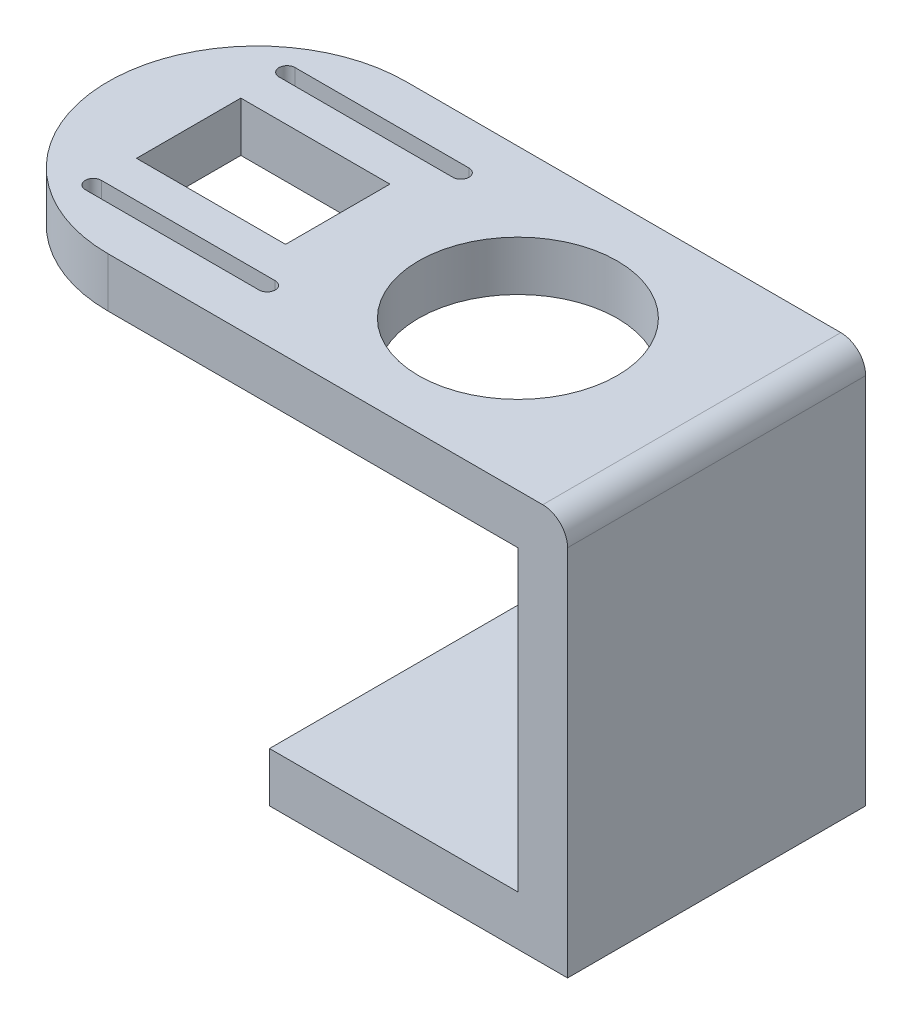
ISO-10303-21;
HEADER;
FILE_DESCRIPTION(('STEP AP214'),'2;1');
FILE_NAME('part.step','',(''),(''),'','','');
FILE_SCHEMA(('AUTOMOTIVE_DESIGN { 1 0 10303 214 1 1 1 1 }'));
ENDSEC;
DATA;
#1=APPLICATION_CONTEXT('core data for automotive mechanical design processes');
#2=APPLICATION_PROTOCOL_DEFINITION('international standard','automotive_design',2000,#1);
#3=PRODUCT_CONTEXT('',#1,'mechanical');
#4=PRODUCT('Part','Part','',(#3));
#5=PRODUCT_RELATED_PRODUCT_CATEGORY('part','',(#4));
#6=PRODUCT_DEFINITION_FORMATION('','',#4);
#7=PRODUCT_DEFINITION_CONTEXT('part definition',#1,'design');
#8=PRODUCT_DEFINITION('design','',#6,#7);
#9=PRODUCT_DEFINITION_SHAPE('','',#8);
#10=(LENGTH_UNIT() NAMED_UNIT(*) SI_UNIT(.MILLI.,.METRE.));
#11=(NAMED_UNIT(*) PLANE_ANGLE_UNIT() SI_UNIT($,.RADIAN.));
#12=(NAMED_UNIT(*) SI_UNIT($,.STERADIAN.) SOLID_ANGLE_UNIT());
#13=UNCERTAINTY_MEASURE_WITH_UNIT(LENGTH_MEASURE(1.E-05),#10,'distance_accuracy_value','');
#14=(GEOMETRIC_REPRESENTATION_CONTEXT(3) GLOBAL_UNCERTAINTY_ASSIGNED_CONTEXT((#13)) GLOBAL_UNIT_ASSIGNED_CONTEXT((#10,
#11,#12)) REPRESENTATION_CONTEXT('',''));
#15=CARTESIAN_POINT('',(0.,0.,0.));
#16=DIRECTION('',(0.,0.,1.));
#17=DIRECTION('',(1.,0.,0.));
#18=AXIS2_PLACEMENT_3D('',#15,#16,#17);
#19=CARTESIAN_POINT('',(-20.,140.,120.));
#20=DIRECTION('',(0.,-1.,0.));
#21=DIRECTION('',(0.,0.,-1.));
#22=AXIS2_PLACEMENT_3D('',#19,#20,#21);
#23=PLANE('',#22);
#24=DIRECTION('',(1.,0.,0.));
#25=VECTOR('',#24,1.);
#26=CARTESIAN_POINT('',(-20.,140.,17.45));
#27=LINE('',#26,#25);
#28=CARTESIAN_POINT('',(-212.234124068661,140.,17.45));
#29=VERTEX_POINT('',#28);
#30=CARTESIAN_POINT('',(-142.234124068661,140.,17.45));
#31=VERTEX_POINT('',#30);
#32=EDGE_CURVE('E228',#29,#31,#27,.T.);
#33=ORIENTED_EDGE('',*,*,#32,.F.);
#34=CARTESIAN_POINT('',(-212.234124068661,140.,20.7));
#35=DIRECTION('',(0.,-1.,0.));
#36=DIRECTION('',(0.,0.,-1.));
#37=AXIS2_PLACEMENT_3D('',#34,#35,#36);
#38=CIRCLE('',#37,3.25);
#39=CARTESIAN_POINT('',(-212.234124068661,140.,23.95));
#40=VERTEX_POINT('',#39);
#41=EDGE_CURVE('E293',#40,#29,#38,.T.);
#42=ORIENTED_EDGE('',*,*,#41,.F.);
#43=DIRECTION('',(1.,0.,0.));
#44=VECTOR('',#43,1.);
#45=CARTESIAN_POINT('',(-20.,140.,23.95));
#46=LINE('',#45,#44);
#47=CARTESIAN_POINT('',(-142.234124068661,140.,23.95));
#48=VERTEX_POINT('',#47);
#49=EDGE_CURVE('E290',#40,#48,#46,.T.);
#50=ORIENTED_EDGE('',*,*,#49,.T.);
#51=CARTESIAN_POINT('',(-142.234124068661,140.,20.7));
#52=DIRECTION('',(0.,-1.,0.));
#53=DIRECTION('',(0.,0.,-1.));
#54=AXIS2_PLACEMENT_3D('',#51,#52,#53);
#55=CIRCLE('',#54,3.25);
#56=EDGE_CURVE('E288',#31,#48,#55,.T.);
#57=ORIENTED_EDGE('',*,*,#56,.F.);
#58=EDGE_LOOP('',(#33,#42,#50,#57));
#59=FACE_BOUND('',#58,.T.);
#60=CARTESIAN_POINT('',(-141.937175822194,140.,99.));
#61=DIRECTION('',(0.,-1.,0.));
#62=DIRECTION('',(0.,0.,-1.));
#63=AXIS2_PLACEMENT_3D('',#60,#61,#62);
#64=CIRCLE('',#63,3.25);
#65=CARTESIAN_POINT('',(-141.937175822194,140.,95.75));
#66=VERTEX_POINT('',#65);
#67=CARTESIAN_POINT('',(-141.937175822194,140.,102.25));
#68=VERTEX_POINT('',#67);
#69=EDGE_CURVE('E285',#66,#68,#64,.T.);
#70=ORIENTED_EDGE('',*,*,#69,.F.);
#71=DIRECTION('',(1.,0.,0.));
#72=VECTOR('',#71,1.);
#73=CARTESIAN_POINT('',(-20.,140.,95.75));
#74=LINE('',#73,#72);
#75=CARTESIAN_POINT('',(-211.937175822194,140.,95.75));
#76=VERTEX_POINT('',#75);
#77=EDGE_CURVE('E283',#76,#66,#74,.T.);
#78=ORIENTED_EDGE('',*,*,#77,.F.);
#79=CARTESIAN_POINT('',(-211.937175822194,140.,99.));
#80=DIRECTION('',(0.,-1.,0.));
#81=DIRECTION('',(0.,0.,-1.));
#82=AXIS2_PLACEMENT_3D('',#79,#80,#81);
#83=CIRCLE('',#82,3.25);
#84=CARTESIAN_POINT('',(-211.937175822194,140.,102.25));
#85=VERTEX_POINT('',#84);
#86=EDGE_CURVE('E281',#85,#76,#83,.T.);
#87=ORIENTED_EDGE('',*,*,#86,.F.);
#88=DIRECTION('',(1.,0.,0.));
#89=VECTOR('',#88,1.);
#90=CARTESIAN_POINT('',(-20.,140.,102.25));
#91=LINE('',#90,#89);
#92=EDGE_CURVE('E256',#85,#68,#91,.T.);
#93=ORIENTED_EDGE('',*,*,#92,.T.);
#94=EDGE_LOOP('',(#70,#78,#87,#93));
#95=FACE_BOUND('',#94,.T.);
#96=CARTESIAN_POINT('',(-53.7500000000003,140.,14.5336663013152));
#97=DIRECTION('',(0.,-1.,0.));
#98=DIRECTION('',(0.,0.,-1.));
#99=AXIS2_PLACEMENT_3D('',#96,#97,#98);
#100=CIRCLE('',#99,2.5);
#101=CARTESIAN_POINT('',(-53.7500000000003,140.,12.0336663013152));
#102=VERTEX_POINT('',#101);
#103=EDGE_CURVE('E328',#102,#102,#100,.T.);
#104=ORIENTED_EDGE('',*,*,#103,.F.);
#105=EDGE_LOOP('',(#104));
#106=FACE_BOUND('',#105,.T.);
#107=CARTESIAN_POINT('',(-132.5,140.,60.));
#108=DIRECTION('',(0.,-1.,0.));
#109=DIRECTION('',(0.,0.,-1.));
#110=AXIS2_PLACEMENT_3D('',#107,#108,#109);
#111=CIRCLE('',#110,2.5);
#112=CARTESIAN_POINT('',(-132.5,140.,57.5));
#113=VERTEX_POINT('',#112);
#114=EDGE_CURVE('E334',#113,#113,#111,.T.);
#115=ORIENTED_EDGE('',*,*,#114,.F.);
#116=EDGE_LOOP('',(#115));
#117=FACE_BOUND('',#116,.T.);
#118=CARTESIAN_POINT('',(-53.7499999999991,140.,105.466333698682));
#119=DIRECTION('',(0.,-1.,0.));
#120=DIRECTION('',(0.,0.,-1.));
#121=AXIS2_PLACEMENT_3D('',#118,#119,#120);
#122=CIRCLE('',#121,2.5);
#123=CARTESIAN_POINT('',(-53.7499999999991,140.,102.966333698682));
#124=VERTEX_POINT('',#123);
#125=EDGE_CURVE('E340',#124,#124,#122,.T.);
#126=ORIENTED_EDGE('',*,*,#125,.F.);
#127=EDGE_LOOP('',(#126));
#128=FACE_BOUND('',#127,.T.);
#129=CARTESIAN_POINT('',(-80.,140.,60.));
#130=DIRECTION('',(0.,-1.,0.));
#131=DIRECTION('',(0.,0.,-1.));
#132=AXIS2_PLACEMENT_3D('',#129,#130,#131);
#133=CIRCLE('',#132,40.);
#134=CARTESIAN_POINT('',(-80.,140.,20.));
#135=VERTEX_POINT('',#134);
#136=EDGE_CURVE('E346',#135,#135,#133,.F.);
#137=ORIENTED_EDGE('',*,*,#136,.T.);
#138=EDGE_LOOP('',(#137));
#139=FACE_BOUND('',#138,.T.);
#140=DIRECTION('',(0.,0.,-1.));
#141=VECTOR('',#140,1.);
#142=CARTESIAN_POINT('',(-20.,140.,120.));
#143=LINE('',#142,#141);
#144=CARTESIAN_POINT('',(-20.,140.,120.));
#145=VERTEX_POINT('',#144);
#146=CARTESIAN_POINT('',(-20.,140.,0.));
#147=VERTEX_POINT('',#146);
#148=EDGE_CURVE('E387',#145,#147,#143,.T.);
#149=ORIENTED_EDGE('',*,*,#148,.F.);
#150=DIRECTION('',(-1.,0.,0.));
#151=VECTOR('',#150,1.);
#152=CARTESIAN_POINT('',(0.,140.,120.));
#153=LINE('',#152,#151);
#154=CARTESIAN_POINT('',(-185.,140.,120.));
#155=VERTEX_POINT('',#154);
#156=EDGE_CURVE('E353',#145,#155,#153,.T.);
#157=ORIENTED_EDGE('',*,*,#156,.T.);
#158=CARTESIAN_POINT('',(-185.,140.,60.));
#159=DIRECTION('',(0.,-1.,0.));
#160=DIRECTION('',(0.,0.,-1.));
#161=AXIS2_PLACEMENT_3D('',#158,#159,#160);
#162=CIRCLE('',#161,60.);
#163=CARTESIAN_POINT('',(-185.,140.,0.));
#164=VERTEX_POINT('',#163);
#165=EDGE_CURVE('E361',#164,#155,#162,.F.);
#166=ORIENTED_EDGE('',*,*,#165,.F.);
#167=DIRECTION('',(-1.,0.,0.));
#168=VECTOR('',#167,1.);
#169=CARTESIAN_POINT('',(0.,140.,0.));
#170=LINE('',#169,#168);
#171=EDGE_CURVE('E347',#147,#164,#170,.T.);
#172=ORIENTED_EDGE('',*,*,#171,.F.);
#173=EDGE_LOOP('',(#149,#157,#166,#172));
#174=FACE_BOUND('',#173,.T.);
#175=DIRECTION('',(0.,0.,-1.));
#176=VECTOR('',#175,1.);
#177=CARTESIAN_POINT('',(-152.526760947637,140.,120.));
#178=LINE('',#177,#176);
#179=CARTESIAN_POINT('',(-152.526760947637,140.,81.));
#180=VERTEX_POINT('',#179);
#181=CARTESIAN_POINT('',(-152.526760947637,140.,39.));
#182=VERTEX_POINT('',#181);
#183=EDGE_CURVE('E322',#180,#182,#178,.T.);
#184=ORIENTED_EDGE('',*,*,#183,.T.);
#185=DIRECTION('',(-1.,0.,0.));
#186=VECTOR('',#185,1.);
#187=CARTESIAN_POINT('',(-20.,140.,39.));
#188=LINE('',#187,#186);
#189=CARTESIAN_POINT('',(-212.526760947637,140.,39.));
#190=VERTEX_POINT('',#189);
#191=EDGE_CURVE('E325',#182,#190,#188,.T.);
#192=ORIENTED_EDGE('',*,*,#191,.T.);
#193=DIRECTION('',(0.,0.,-1.));
#194=VECTOR('',#193,1.);
#195=CARTESIAN_POINT('',(-212.526760947637,140.,120.));
#196=LINE('',#195,#194);
#197=CARTESIAN_POINT('',(-212.526760947637,140.,81.));
#198=VERTEX_POINT('',#197);
#199=EDGE_CURVE('E311',#198,#190,#196,.T.);
#200=ORIENTED_EDGE('',*,*,#199,.F.);
#201=DIRECTION('',(-1.,0.,0.));
#202=VECTOR('',#201,1.);
#203=CARTESIAN_POINT('',(-20.,140.,81.));
#204=LINE('',#203,#202);
#205=EDGE_CURVE('E319',#180,#198,#204,.T.);
#206=ORIENTED_EDGE('',*,*,#205,.F.);
#207=EDGE_LOOP('',(#184,#192,#200,#206));
#208=FACE_BOUND('',#207,.T.);
#209=ADVANCED_FACE('F68',(#59,#95,#106,#117,#128,#139,#174,#208),#23,.T.);
#210=CARTESIAN_POINT('',(0.,160.,120.));
#211=DIRECTION('',(0.,-1.,0.));
#212=DIRECTION('',(1.,0.,0.));
#213=AXIS2_PLACEMENT_3D('',#210,#211,#212);
#214=PLANE('',#213);
#215=CARTESIAN_POINT('',(-212.234124068661,160.,20.7));
#216=DIRECTION('',(0.,-1.,0.));
#217=DIRECTION('',(0.,0.,-1.));
#218=AXIS2_PLACEMENT_3D('',#215,#216,#217);
#219=CIRCLE('',#218,3.25);
#220=CARTESIAN_POINT('',(-212.234124068661,160.,23.95));
#221=VERTEX_POINT('',#220);
#222=CARTESIAN_POINT('',(-212.234124068661,160.,17.45));
#223=VERTEX_POINT('',#222);
#224=EDGE_CURVE('E232',#221,#223,#219,.T.);
#225=ORIENTED_EDGE('',*,*,#224,.T.);
#226=DIRECTION('',(1.,0.,0.));
#227=VECTOR('',#226,1.);
#228=CARTESIAN_POINT('',(0.,160.,17.45));
#229=LINE('',#228,#227);
#230=CARTESIAN_POINT('',(-142.234124068661,160.,17.45));
#231=VERTEX_POINT('',#230);
#232=EDGE_CURVE('E225',#223,#231,#229,.T.);
#233=ORIENTED_EDGE('',*,*,#232,.T.);
#234=CARTESIAN_POINT('',(-142.234124068661,160.,20.7));
#235=DIRECTION('',(0.,-1.,0.));
#236=DIRECTION('',(0.,0.,-1.));
#237=AXIS2_PLACEMENT_3D('',#234,#235,#236);
#238=CIRCLE('',#237,3.25);
#239=CARTESIAN_POINT('',(-142.234124068661,160.,23.95));
#240=VERTEX_POINT('',#239);
#241=EDGE_CURVE('E235',#231,#240,#238,.T.);
#242=ORIENTED_EDGE('',*,*,#241,.T.);
#243=DIRECTION('',(1.,0.,0.));
#244=VECTOR('',#243,1.);
#245=CARTESIAN_POINT('',(0.,160.,23.95));
#246=LINE('',#245,#244);
#247=EDGE_CURVE('E241',#221,#240,#246,.T.);
#248=ORIENTED_EDGE('',*,*,#247,.F.);
#249=EDGE_LOOP('',(#225,#233,#242,#248));
#250=FACE_BOUND('',#249,.T.);
#251=DIRECTION('',(1.,0.,0.));
#252=VECTOR('',#251,1.);
#253=CARTESIAN_POINT('',(-211.937175822194,160.,95.75));
#254=LINE('',#253,#252);
#255=CARTESIAN_POINT('',(-211.937175822194,160.,95.75));
#256=VERTEX_POINT('',#255);
#257=CARTESIAN_POINT('',(-141.937175822194,160.,95.75));
#258=VERTEX_POINT('',#257);
#259=EDGE_CURVE('E263',#256,#258,#254,.T.);
#260=ORIENTED_EDGE('',*,*,#259,.T.);
#261=CARTESIAN_POINT('',(-141.937175822194,160.,99.));
#262=DIRECTION('',(0.,-1.,0.));
#263=DIRECTION('',(0.,0.,-1.));
#264=AXIS2_PLACEMENT_3D('',#261,#262,#263);
#265=CIRCLE('',#264,3.25);
#266=CARTESIAN_POINT('',(-141.937175822194,160.,102.25));
#267=VERTEX_POINT('',#266);
#268=EDGE_CURVE('E246',#258,#267,#265,.T.);
#269=ORIENTED_EDGE('',*,*,#268,.T.);
#270=DIRECTION('',(1.,0.,0.));
#271=VECTOR('',#270,1.);
#272=CARTESIAN_POINT('',(-211.937175822194,160.,102.25));
#273=LINE('',#272,#271);
#274=CARTESIAN_POINT('',(-211.937175822194,160.,102.25));
#275=VERTEX_POINT('',#274);
#276=EDGE_CURVE('E249',#275,#267,#273,.T.);
#277=ORIENTED_EDGE('',*,*,#276,.F.);
#278=CARTESIAN_POINT('',(-211.937175822194,160.,99.));
#279=DIRECTION('',(0.,-1.,0.));
#280=DIRECTION('',(0.,0.,-1.));
#281=AXIS2_PLACEMENT_3D('',#278,#279,#280);
#282=CIRCLE('',#281,3.25);
#283=EDGE_CURVE('E275',#275,#256,#282,.T.);
#284=ORIENTED_EDGE('',*,*,#283,.T.);
#285=EDGE_LOOP('',(#260,#269,#277,#284));
#286=FACE_BOUND('',#285,.T.);
#287=DIRECTION('',(-1.,0.,0.));
#288=VECTOR('',#287,1.);
#289=CARTESIAN_POINT('',(0.,160.,120.));
#290=LINE('',#289,#288);
#291=CARTESIAN_POINT('',(-10.,160.,120.));
#292=VERTEX_POINT('',#291);
#293=CARTESIAN_POINT('',(-185.,160.,120.));
#294=VERTEX_POINT('',#293);
#295=EDGE_CURVE('E350',#292,#294,#290,.T.);
#296=ORIENTED_EDGE('',*,*,#295,.F.);
#297=DIRECTION('',(0.,0.,-1.));
#298=VECTOR('',#297,1.);
#299=CARTESIAN_POINT('',(-10.,160.,120.));
#300=LINE('',#299,#298);
#301=CARTESIAN_POINT('',(-10.,160.,0.));
#302=VERTEX_POINT('',#301);
#303=EDGE_CURVE('E410',#292,#302,#300,.T.);
#304=ORIENTED_EDGE('',*,*,#303,.T.);
#305=DIRECTION('',(-1.,0.,0.));
#306=VECTOR('',#305,1.);
#307=CARTESIAN_POINT('',(0.,160.,0.));
#308=LINE('',#307,#306);
#309=CARTESIAN_POINT('',(-185.,160.,0.));
#310=VERTEX_POINT('',#309);
#311=EDGE_CURVE('E349',#302,#310,#308,.T.);
#312=ORIENTED_EDGE('',*,*,#311,.T.);
#313=CARTESIAN_POINT('',(-185.,160.,60.));
#314=DIRECTION('',(0.,1.,0.));
#315=DIRECTION('',(-1.,0.,0.));
#316=AXIS2_PLACEMENT_3D('',#313,#314,#315);
#317=CIRCLE('',#316,60.);
#318=EDGE_CURVE('E364',#310,#294,#317,.T.);
#319=ORIENTED_EDGE('',*,*,#318,.T.);
#320=EDGE_LOOP('',(#296,#304,#312,#319));
#321=FACE_BOUND('',#320,.T.);
#322=CARTESIAN_POINT('',(-80.,160.,60.));
#323=DIRECTION('',(0.,-1.,0.));
#324=DIRECTION('',(1.,0.,0.));
#325=AXIS2_PLACEMENT_3D('',#322,#323,#324);
#326=CIRCLE('',#325,40.);
#327=CARTESIAN_POINT('',(-40.,160.,60.));
#328=VERTEX_POINT('',#327);
#329=EDGE_CURVE('E367',#328,#328,#326,.T.);
#330=ORIENTED_EDGE('',*,*,#329,.T.);
#331=EDGE_LOOP('',(#330));
#332=FACE_BOUND('',#331,.T.);
#333=DIRECTION('',(1.,0.,0.));
#334=VECTOR('',#333,1.);
#335=CARTESIAN_POINT('',(0.,160.,39.));
#336=LINE('',#335,#334);
#337=CARTESIAN_POINT('',(-212.526760947637,160.,39.));
#338=VERTEX_POINT('',#337);
#339=CARTESIAN_POINT('',(-152.526760947637,160.,39.));
#340=VERTEX_POINT('',#339);
#341=EDGE_CURVE('E296',#338,#340,#336,.T.);
#342=ORIENTED_EDGE('',*,*,#341,.T.);
#343=DIRECTION('',(0.,0.,1.));
#344=VECTOR('',#343,1.);
#345=CARTESIAN_POINT('',(-152.526760947637,160.,0.));
#346=LINE('',#345,#344);
#347=CARTESIAN_POINT('',(-152.526760947637,160.,81.));
#348=VERTEX_POINT('',#347);
#349=EDGE_CURVE('E305',#340,#348,#346,.T.);
#350=ORIENTED_EDGE('',*,*,#349,.T.);
#351=DIRECTION('',(1.,0.,0.));
#352=VECTOR('',#351,1.);
#353=CARTESIAN_POINT('',(0.,160.,81.));
#354=LINE('',#353,#352);
#355=CARTESIAN_POINT('',(-212.526760947637,160.,81.));
#356=VERTEX_POINT('',#355);
#357=EDGE_CURVE('E302',#356,#348,#354,.T.);
#358=ORIENTED_EDGE('',*,*,#357,.F.);
#359=DIRECTION('',(0.,0.,1.));
#360=VECTOR('',#359,1.);
#361=CARTESIAN_POINT('',(-212.526760947637,160.,0.));
#362=LINE('',#361,#360);
#363=EDGE_CURVE('E299',#338,#356,#362,.T.);
#364=ORIENTED_EDGE('',*,*,#363,.F.);
#365=EDGE_LOOP('',(#342,#350,#358,#364));
#366=FACE_BOUND('',#365,.T.);
#367=ADVANCED_FACE('F243',(#250,#286,#321,#332,#366),#214,.F.);
#368=CARTESIAN_POINT('',(-120.,0.,120.));
#369=DIRECTION('',(-1.,0.,0.));
#370=DIRECTION('',(0.,0.,1.));
#371=AXIS2_PLACEMENT_3D('',#368,#369,#370);
#372=PLANE('',#371);
#373=DIRECTION('',(0.,1.,0.));
#374=VECTOR('',#373,1.);
#375=CARTESIAN_POINT('',(-120.,0.,0.));
#376=LINE('',#375,#374);
#377=CARTESIAN_POINT('',(-120.,0.,0.));
#378=VERTEX_POINT('',#377);
#379=CARTESIAN_POINT('',(-120.,20.,0.));
#380=VERTEX_POINT('',#379);
#381=EDGE_CURVE('E393',#378,#380,#376,.T.);
#382=ORIENTED_EDGE('',*,*,#381,.F.);
#383=DIRECTION('',(0.,0.,-1.));
#384=VECTOR('',#383,1.);
#385=CARTESIAN_POINT('',(-120.,0.,120.));
#386=LINE('',#385,#384);
#387=CARTESIAN_POINT('',(-120.,0.,120.));
#388=VERTEX_POINT('',#387);
#389=EDGE_CURVE('E404',#388,#378,#386,.T.);
#390=ORIENTED_EDGE('',*,*,#389,.F.);
#391=DIRECTION('',(0.,1.,0.));
#392=VECTOR('',#391,1.);
#393=CARTESIAN_POINT('',(-120.,0.,120.));
#394=LINE('',#393,#392);
#395=CARTESIAN_POINT('',(-120.,20.,120.));
#396=VERTEX_POINT('',#395);
#397=EDGE_CURVE('E379',#388,#396,#394,.T.);
#398=ORIENTED_EDGE('',*,*,#397,.T.);
#399=DIRECTION('',(0.,0.,-1.));
#400=VECTOR('',#399,1.);
#401=CARTESIAN_POINT('',(-120.,20.,120.));
#402=LINE('',#401,#400);
#403=EDGE_CURVE('E406',#396,#380,#402,.T.);
#404=ORIENTED_EDGE('',*,*,#403,.T.);
#405=EDGE_LOOP('',(#382,#390,#398,#404));
#406=FACE_BOUND('',#405,.T.);
#407=ADVANCED_FACE('F443',(#406),#372,.T.);
#408=CARTESIAN_POINT('',(0.,20.,120.));
#409=DIRECTION('',(0.,-1.,0.));
#410=DIRECTION('',(0.,0.,-1.));
#411=AXIS2_PLACEMENT_3D('',#408,#409,#410);
#412=PLANE('',#411);
#413=DIRECTION('',(-1.,0.,0.));
#414=VECTOR('',#413,1.);
#415=CARTESIAN_POINT('',(0.,20.,0.));
#416=LINE('',#415,#414);
#417=CARTESIAN_POINT('',(-20.,20.,0.));
#418=VERTEX_POINT('',#417);
#419=EDGE_CURVE('E390',#418,#380,#416,.T.);
#420=ORIENTED_EDGE('',*,*,#419,.T.);
#421=ORIENTED_EDGE('',*,*,#403,.F.);
#422=DIRECTION('',(-1.,0.,0.));
#423=VECTOR('',#422,1.);
#424=CARTESIAN_POINT('',(0.,20.,120.));
#425=LINE('',#424,#423);
#426=CARTESIAN_POINT('',(-20.,20.,120.));
#427=VERTEX_POINT('',#426);
#428=EDGE_CURVE('E376',#427,#396,#425,.T.);
#429=ORIENTED_EDGE('',*,*,#428,.F.);
#430=DIRECTION('',(0.,0.,-1.));
#431=VECTOR('',#430,1.);
#432=CARTESIAN_POINT('',(-20.,20.,120.));
#433=LINE('',#432,#431);
#434=EDGE_CURVE('E408',#427,#418,#433,.T.);
#435=ORIENTED_EDGE('',*,*,#434,.T.);
#436=EDGE_LOOP('',(#420,#421,#429,#435));
#437=FACE_BOUND('',#436,.T.);
#438=ADVANCED_FACE('F464',(#437),#412,.F.);
#439=CARTESIAN_POINT('',(0.,0.,120.));
#440=DIRECTION('',(0.,-1.,0.));
#441=DIRECTION('',(0.,0.,-1.));
#442=AXIS2_PLACEMENT_3D('',#439,#440,#441);
#443=PLANE('',#442);
#444=DIRECTION('',(-1.,0.,0.));
#445=VECTOR('',#444,1.);
#446=CARTESIAN_POINT('',(0.,0.,0.));
#447=LINE('',#446,#445);
#448=CARTESIAN_POINT('',(0.,0.,0.));
#449=VERTEX_POINT('',#448);
#450=EDGE_CURVE('E396',#449,#378,#447,.T.);
#451=ORIENTED_EDGE('',*,*,#450,.F.);
#452=DIRECTION('',(0.,0.,-1.));
#453=VECTOR('',#452,1.);
#454=CARTESIAN_POINT('',(0.,0.,120.));
#455=LINE('',#454,#453);
#456=CARTESIAN_POINT('',(0.,0.,120.));
#457=VERTEX_POINT('',#456);
#458=EDGE_CURVE('E402',#457,#449,#455,.T.);
#459=ORIENTED_EDGE('',*,*,#458,.F.);
#460=DIRECTION('',(-1.,0.,0.));
#461=VECTOR('',#460,1.);
#462=CARTESIAN_POINT('',(0.,0.,120.));
#463=LINE('',#462,#461);
#464=EDGE_CURVE('E382',#457,#388,#463,.T.);
#465=ORIENTED_EDGE('',*,*,#464,.T.);
#466=ORIENTED_EDGE('',*,*,#389,.T.);
#467=EDGE_LOOP('',(#451,#459,#465,#466));
#468=FACE_BOUND('',#467,.T.);
#469=ADVANCED_FACE('F456',(#468),#443,.T.);
#470=CARTESIAN_POINT('',(0.,0.,120.));
#471=DIRECTION('',(0.,0.,1.));
#472=DIRECTION('',(1.,0.,0.));
#473=AXIS2_PLACEMENT_3D('',#470,#471,#472);
#474=PLANE('',#473);
#475=DIRECTION('',(0.,1.,0.));
#476=VECTOR('',#475,1.);
#477=CARTESIAN_POINT('',(0.,0.,120.));
#478=LINE('',#477,#476);
#479=CARTESIAN_POINT('',(0.,150.,120.));
#480=VERTEX_POINT('',#479);
#481=EDGE_CURVE('E385',#457,#480,#478,.T.);
#482=ORIENTED_EDGE('',*,*,#481,.T.);
#483=CARTESIAN_POINT('',(-10.,150.,120.));
#484=DIRECTION('',(0.,0.,1.));
#485=DIRECTION('',(1.,0.,0.));
#486=AXIS2_PLACEMENT_3D('',#483,#484,#485);
#487=CIRCLE('',#486,10.);
#488=EDGE_CURVE('E13',#480,#292,#487,.T.);
#489=ORIENTED_EDGE('',*,*,#488,.T.);
#490=ORIENTED_EDGE('',*,*,#295,.T.);
#491=DIRECTION('',(0.,1.,0.));
#492=VECTOR('',#491,1.);
#493=CARTESIAN_POINT('',(-185.,-7.05441169852744,120.));
#494=LINE('',#493,#492);
#495=EDGE_CURVE('E358',#155,#294,#494,.T.);
#496=ORIENTED_EDGE('',*,*,#495,.F.);
#497=ORIENTED_EDGE('',*,*,#156,.F.);
#498=DIRECTION('',(0.,1.,0.));
#499=VECTOR('',#498,1.);
#500=CARTESIAN_POINT('',(-20.,0.,120.));
#501=LINE('',#500,#499);
#502=EDGE_CURVE('E373',#427,#145,#501,.T.);
#503=ORIENTED_EDGE('',*,*,#502,.F.);
#504=ORIENTED_EDGE('',*,*,#428,.T.);
#505=ORIENTED_EDGE('',*,*,#397,.F.);
#506=ORIENTED_EDGE('',*,*,#464,.F.);
#507=EDGE_LOOP('',(#482,#489,#490,#496,#497,#503,#504,#505,#506));
#508=FACE_BOUND('',#507,.T.);
#509=ADVANCED_FACE('F427',(#508),#474,.T.);
#510=CARTESIAN_POINT('',(0.,0.,0.));
#511=DIRECTION('',(0.,0.,1.));
#512=DIRECTION('',(1.,0.,0.));
#513=AXIS2_PLACEMENT_3D('',#510,#511,#512);
#514=PLANE('',#513);
#515=ORIENTED_EDGE('',*,*,#311,.F.);
#516=CARTESIAN_POINT('',(-10.,150.,0.));
#517=DIRECTION('',(0.,0.,1.));
#518=DIRECTION('',(1.,0.,0.));
#519=AXIS2_PLACEMENT_3D('',#516,#517,#518);
#520=CIRCLE('',#519,10.);
#521=CARTESIAN_POINT('',(0.,150.,0.));
#522=VERTEX_POINT('',#521);
#523=EDGE_CURVE('E90',#302,#522,#520,.F.);
#524=ORIENTED_EDGE('',*,*,#523,.T.);
#525=DIRECTION('',(0.,1.,0.));
#526=VECTOR('',#525,1.);
#527=CARTESIAN_POINT('',(0.,0.,0.));
#528=LINE('',#527,#526);
#529=EDGE_CURVE('E377',#449,#522,#528,.T.);
#530=ORIENTED_EDGE('',*,*,#529,.F.);
#531=ORIENTED_EDGE('',*,*,#450,.T.);
#532=ORIENTED_EDGE('',*,*,#381,.T.);
#533=ORIENTED_EDGE('',*,*,#419,.F.);
#534=DIRECTION('',(0.,1.,0.));
#535=VECTOR('',#534,1.);
#536=CARTESIAN_POINT('',(-20.,0.,0.));
#537=LINE('',#536,#535);
#538=EDGE_CURVE('E370',#418,#147,#537,.T.);
#539=ORIENTED_EDGE('',*,*,#538,.T.);
#540=ORIENTED_EDGE('',*,*,#171,.T.);
#541=DIRECTION('',(0.,1.,0.));
#542=VECTOR('',#541,1.);
#543=CARTESIAN_POINT('',(-185.,-7.05441169852744,0.));
#544=LINE('',#543,#542);
#545=EDGE_CURVE('E352',#164,#310,#544,.T.);
#546=ORIENTED_EDGE('',*,*,#545,.T.);
#547=EDGE_LOOP('',(#515,#524,#530,#531,#532,#533,#539,#540,#546));
#548=FACE_BOUND('',#547,.T.);
#549=ADVANCED_FACE('F419',(#548),#514,.F.);
#550=CARTESIAN_POINT('',(0.,0.,120.));
#551=DIRECTION('',(-1.,0.,0.));
#552=DIRECTION('',(0.,0.,1.));
#553=AXIS2_PLACEMENT_3D('',#550,#551,#552);
#554=PLANE('',#553);
#555=ORIENTED_EDGE('',*,*,#529,.T.);
#556=DIRECTION('',(0.,0.,-1.));
#557=VECTOR('',#556,1.);
#558=CARTESIAN_POINT('',(0.,150.,120.));
#559=LINE('',#558,#557);
#560=EDGE_CURVE('E76',#522,#480,#559,.F.);
#561=ORIENTED_EDGE('',*,*,#560,.T.);
#562=ORIENTED_EDGE('',*,*,#481,.F.);
#563=ORIENTED_EDGE('',*,*,#458,.T.);
#564=EDGE_LOOP('',(#555,#561,#562,#563));
#565=FACE_BOUND('',#564,.T.);
#566=ADVANCED_FACE('F459',(#565),#554,.F.);
#567=CARTESIAN_POINT('',(-20.,0.,120.));
#568=DIRECTION('',(-1.,0.,0.));
#569=DIRECTION('',(0.,0.,1.));
#570=AXIS2_PLACEMENT_3D('',#567,#568,#569);
#571=PLANE('',#570);
#572=ORIENTED_EDGE('',*,*,#538,.F.);
#573=ORIENTED_EDGE('',*,*,#434,.F.);
#574=ORIENTED_EDGE('',*,*,#502,.T.);
#575=ORIENTED_EDGE('',*,*,#148,.T.);
#576=EDGE_LOOP('',(#572,#573,#574,#575));
#577=FACE_BOUND('',#576,.T.);
#578=ADVANCED_FACE('F445',(#577),#571,.T.);
#579=CARTESIAN_POINT('',(-185.,-7.05441169852744,60.));
#580=DIRECTION('',(0.,1.,0.));
#581=DIRECTION('',(-1.,0.,0.));
#582=AXIS2_PLACEMENT_3D('',#579,#580,#581);
#583=CYLINDRICAL_SURFACE('',#582,60.);
#584=ORIENTED_EDGE('',*,*,#545,.F.);
#585=ORIENTED_EDGE('',*,*,#165,.T.);
#586=ORIENTED_EDGE('',*,*,#495,.T.);
#587=ORIENTED_EDGE('',*,*,#318,.F.);
#588=EDGE_LOOP('',(#584,#585,#586,#587));
#589=FACE_BOUND('',#588,.T.);
#590=ADVANCED_FACE('F424',(#589),#583,.T.);
#591=CARTESIAN_POINT('',(-80.,165.,60.));
#592=DIRECTION('',(0.,-1.,0.));
#593=DIRECTION('',(0.,0.,-1.));
#594=AXIS2_PLACEMENT_3D('',#591,#592,#593);
#595=CYLINDRICAL_SURFACE('',#594,40.);
#596=ORIENTED_EDGE('',*,*,#329,.F.);
#597=EDGE_LOOP('',(#596));
#598=FACE_BOUND('',#597,.T.);
#599=ORIENTED_EDGE('',*,*,#136,.F.);
#600=EDGE_LOOP('',(#599));
#601=FACE_BOUND('',#600,.T.);
#602=ADVANCED_FACE('F449',(#598,#601),#595,.F.);
#603=CARTESIAN_POINT('',(-53.7499999999991,142.497848452431,105.466333698682));
#604=DIRECTION('',(0.,-1.,0.));
#605=DIRECTION('',(0.,0.,-1.));
#606=AXIS2_PLACEMENT_3D('',#603,#604,#605);
#607=CONICAL_SURFACE('',#606,2.5,1.02974425867665);
#608=CARTESIAN_POINT('',(-53.7499999999991,144.,105.466333698682));
#609=VERTEX_POINT('',#608);
#610=VERTEX_LOOP('',#609);
#611=FACE_BOUND('',#610,.T.);
#612=CARTESIAN_POINT('',(-53.7499999999991,142.497848452431,105.466333698682));
#613=DIRECTION('',(0.,-1.,0.));
#614=DIRECTION('',(0.,0.,-1.));
#615=AXIS2_PLACEMENT_3D('',#612,#613,#614);
#616=CIRCLE('',#615,2.5);
#617=CARTESIAN_POINT('',(-53.7499999999991,142.497848452431,102.966333698682));
#618=VERTEX_POINT('',#617);
#619=EDGE_CURVE('E343',#618,#618,#616,.T.);
#620=ORIENTED_EDGE('',*,*,#619,.T.);
#621=EDGE_LOOP('',(#620));
#622=FACE_BOUND('',#621,.T.);
#623=ADVANCED_FACE('F452',(#611,#622),#607,.F.);
#624=CARTESIAN_POINT('',(-53.7499999999991,140.,105.466333698682));
#625=DIRECTION('',(0.,-1.,0.));
#626=DIRECTION('',(0.,0.,-1.));
#627=AXIS2_PLACEMENT_3D('',#624,#625,#626);
#628=CYLINDRICAL_SURFACE('',#627,2.5);
#629=ORIENTED_EDGE('',*,*,#619,.F.);
#630=EDGE_LOOP('',(#629));
#631=FACE_BOUND('',#630,.T.);
#632=ORIENTED_EDGE('',*,*,#125,.T.);
#633=EDGE_LOOP('',(#632));
#634=FACE_BOUND('',#633,.T.);
#635=ADVANCED_FACE('F532',(#631,#634),#628,.F.);
#636=CARTESIAN_POINT('',(-132.5,142.497848452431,60.));
#637=DIRECTION('',(0.,-1.,0.));
#638=DIRECTION('',(0.,0.,-1.));
#639=AXIS2_PLACEMENT_3D('',#636,#637,#638);
#640=CONICAL_SURFACE('',#639,2.5,1.02974425867665);
#641=CARTESIAN_POINT('',(-132.5,144.,60.));
#642=VERTEX_POINT('',#641);
#643=VERTEX_LOOP('',#642);
#644=FACE_BOUND('',#643,.T.);
#645=CARTESIAN_POINT('',(-132.5,142.497848452431,60.));
#646=DIRECTION('',(0.,-1.,0.));
#647=DIRECTION('',(0.,0.,-1.));
#648=AXIS2_PLACEMENT_3D('',#645,#646,#647);
#649=CIRCLE('',#648,2.5);
#650=CARTESIAN_POINT('',(-132.5,142.497848452431,57.5));
#651=VERTEX_POINT('',#650);
#652=EDGE_CURVE('E337',#651,#651,#649,.T.);
#653=ORIENTED_EDGE('',*,*,#652,.T.);
#654=EDGE_LOOP('',(#653));
#655=FACE_BOUND('',#654,.T.);
#656=ADVANCED_FACE('F528',(#644,#655),#640,.F.);
#657=CARTESIAN_POINT('',(-132.5,140.,60.));
#658=DIRECTION('',(0.,-1.,0.));
#659=DIRECTION('',(0.,0.,-1.));
#660=AXIS2_PLACEMENT_3D('',#657,#658,#659);
#661=CYLINDRICAL_SURFACE('',#660,2.5);
#662=ORIENTED_EDGE('',*,*,#652,.F.);
#663=EDGE_LOOP('',(#662));
#664=FACE_BOUND('',#663,.T.);
#665=ORIENTED_EDGE('',*,*,#114,.T.);
#666=EDGE_LOOP('',(#665));
#667=FACE_BOUND('',#666,.T.);
#668=ADVANCED_FACE('F524',(#664,#667),#661,.F.);
#669=CARTESIAN_POINT('',(-53.7500000000003,142.497848452431,14.5336663013152));
#670=DIRECTION('',(0.,-1.,0.));
#671=DIRECTION('',(0.,0.,-1.));
#672=AXIS2_PLACEMENT_3D('',#669,#670,#671);
#673=CONICAL_SURFACE('',#672,2.5,1.02974425867665);
#674=CARTESIAN_POINT('',(-53.7500000000003,144.,14.5336663013152));
#675=VERTEX_POINT('',#674);
#676=VERTEX_LOOP('',#675);
#677=FACE_BOUND('',#676,.T.);
#678=CARTESIAN_POINT('',(-53.7500000000003,142.497848452431,14.5336663013152));
#679=DIRECTION('',(0.,-1.,0.));
#680=DIRECTION('',(0.,0.,-1.));
#681=AXIS2_PLACEMENT_3D('',#678,#679,#680);
#682=CIRCLE('',#681,2.5);
#683=CARTESIAN_POINT('',(-53.7500000000003,142.497848452431,12.0336663013152));
#684=VERTEX_POINT('',#683);
#685=EDGE_CURVE('E331',#684,#684,#682,.T.);
#686=ORIENTED_EDGE('',*,*,#685,.T.);
#687=EDGE_LOOP('',(#686));
#688=FACE_BOUND('',#687,.T.);
#689=ADVANCED_FACE('F520',(#677,#688),#673,.F.);
#690=CARTESIAN_POINT('',(-53.7500000000003,140.,14.5336663013152));
#691=DIRECTION('',(0.,-1.,0.));
#692=DIRECTION('',(0.,0.,-1.));
#693=AXIS2_PLACEMENT_3D('',#690,#691,#692);
#694=CYLINDRICAL_SURFACE('',#693,2.5);
#695=ORIENTED_EDGE('',*,*,#685,.F.);
#696=EDGE_LOOP('',(#695));
#697=FACE_BOUND('',#696,.T.);
#698=ORIENTED_EDGE('',*,*,#103,.T.);
#699=EDGE_LOOP('',(#698));
#700=FACE_BOUND('',#699,.T.);
#701=ADVANCED_FACE('F517',(#697,#700),#694,.F.);
#702=CARTESIAN_POINT('',(0.,0.,39.));
#703=DIRECTION('',(0.,0.,1.));
#704=DIRECTION('',(1.,0.,0.));
#705=AXIS2_PLACEMENT_3D('',#702,#703,#704);
#706=PLANE('',#705);
#707=DIRECTION('',(0.,1.,0.));
#708=VECTOR('',#707,1.);
#709=CARTESIAN_POINT('',(-152.526760947637,0.,39.));
#710=LINE('',#709,#708);
#711=EDGE_CURVE('E309',#182,#340,#710,.T.);
#712=ORIENTED_EDGE('',*,*,#711,.T.);
#713=ORIENTED_EDGE('',*,*,#341,.F.);
#714=DIRECTION('',(0.,1.,0.));
#715=VECTOR('',#714,1.);
#716=CARTESIAN_POINT('',(-212.526760947637,0.,39.));
#717=LINE('',#716,#715);
#718=EDGE_CURVE('E308',#190,#338,#717,.T.);
#719=ORIENTED_EDGE('',*,*,#718,.F.);
#720=ORIENTED_EDGE('',*,*,#191,.F.);
#721=EDGE_LOOP('',(#712,#713,#719,#720));
#722=FACE_BOUND('',#721,.T.);
#723=ADVANCED_FACE('F499',(#722),#706,.T.);
#724=CARTESIAN_POINT('',(-152.526760947637,0.,0.));
#725=DIRECTION('',(-1.,0.,0.));
#726=DIRECTION('',(0.,-1.,0.));
#727=AXIS2_PLACEMENT_3D('',#724,#725,#726);
#728=PLANE('',#727);
#729=DIRECTION('',(0.,1.,0.));
#730=VECTOR('',#729,1.);
#731=CARTESIAN_POINT('',(-152.526760947637,0.,81.));
#732=LINE('',#731,#730);
#733=EDGE_CURVE('E312',#180,#348,#732,.T.);
#734=ORIENTED_EDGE('',*,*,#733,.T.);
#735=ORIENTED_EDGE('',*,*,#349,.F.);
#736=ORIENTED_EDGE('',*,*,#711,.F.);
#737=ORIENTED_EDGE('',*,*,#183,.F.);
#738=EDGE_LOOP('',(#734,#735,#736,#737));
#739=FACE_BOUND('',#738,.T.);
#740=ADVANCED_FACE('F490',(#739),#728,.T.);
#741=CARTESIAN_POINT('',(0.,0.,81.));
#742=DIRECTION('',(0.,0.,1.));
#743=DIRECTION('',(1.,0.,0.));
#744=AXIS2_PLACEMENT_3D('',#741,#742,#743);
#745=PLANE('',#744);
#746=ORIENTED_EDGE('',*,*,#205,.T.);
#747=DIRECTION('',(0.,1.,0.));
#748=VECTOR('',#747,1.);
#749=CARTESIAN_POINT('',(-212.526760947637,0.,81.));
#750=LINE('',#749,#748);
#751=EDGE_CURVE('E314',#198,#356,#750,.T.);
#752=ORIENTED_EDGE('',*,*,#751,.T.);
#753=ORIENTED_EDGE('',*,*,#357,.T.);
#754=ORIENTED_EDGE('',*,*,#733,.F.);
#755=EDGE_LOOP('',(#746,#752,#753,#754));
#756=FACE_BOUND('',#755,.T.);
#757=ADVANCED_FACE('F493',(#756),#745,.F.);
#758=CARTESIAN_POINT('',(-212.526760947637,0.,0.));
#759=DIRECTION('',(-1.,0.,0.));
#760=DIRECTION('',(0.,-1.,0.));
#761=AXIS2_PLACEMENT_3D('',#758,#759,#760);
#762=PLANE('',#761);
#763=ORIENTED_EDGE('',*,*,#199,.T.);
#764=ORIENTED_EDGE('',*,*,#718,.T.);
#765=ORIENTED_EDGE('',*,*,#363,.T.);
#766=ORIENTED_EDGE('',*,*,#751,.F.);
#767=EDGE_LOOP('',(#763,#764,#765,#766));
#768=FACE_BOUND('',#767,.T.);
#769=ADVANCED_FACE('F501',(#768),#762,.F.);
#770=CARTESIAN_POINT('',(-141.937175822194,160.,99.));
#771=DIRECTION('',(0.,-1.,0.));
#772=DIRECTION('',(0.,0.,-1.));
#773=AXIS2_PLACEMENT_3D('',#770,#771,#772);
#774=CYLINDRICAL_SURFACE('',#773,3.25);
#775=ORIENTED_EDGE('',*,*,#69,.T.);
#776=DIRECTION('',(0.,-1.,0.));
#777=VECTOR('',#776,1.);
#778=CARTESIAN_POINT('',(-141.937175822194,160.,102.25));
#779=LINE('',#778,#777);
#780=EDGE_CURVE('E261',#267,#68,#779,.T.);
#781=ORIENTED_EDGE('',*,*,#780,.F.);
#782=ORIENTED_EDGE('',*,*,#268,.F.);
#783=DIRECTION('',(0.,-1.,0.));
#784=VECTOR('',#783,1.);
#785=CARTESIAN_POINT('',(-141.937175822194,160.,95.75));
#786=LINE('',#785,#784);
#787=EDGE_CURVE('E270',#258,#66,#786,.T.);
#788=ORIENTED_EDGE('',*,*,#787,.T.);
#789=EDGE_LOOP('',(#775,#781,#782,#788));
#790=FACE_BOUND('',#789,.T.);
#791=ADVANCED_FACE('F503',(#790),#774,.F.);
#792=CARTESIAN_POINT('',(-211.937175822194,160.,95.75));
#793=DIRECTION('',(0.,0.,-1.));
#794=DIRECTION('',(-1.,0.,0.));
#795=AXIS2_PLACEMENT_3D('',#792,#793,#794);
#796=PLANE('',#795);
#797=ORIENTED_EDGE('',*,*,#77,.T.);
#798=ORIENTED_EDGE('',*,*,#787,.F.);
#799=ORIENTED_EDGE('',*,*,#259,.F.);
#800=DIRECTION('',(0.,-1.,0.));
#801=VECTOR('',#800,1.);
#802=CARTESIAN_POINT('',(-211.937175822194,160.,95.75));
#803=LINE('',#802,#801);
#804=EDGE_CURVE('E267',#256,#76,#803,.T.);
#805=ORIENTED_EDGE('',*,*,#804,.T.);
#806=EDGE_LOOP('',(#797,#798,#799,#805));
#807=FACE_BOUND('',#806,.T.);
#808=ADVANCED_FACE('F509',(#807),#796,.F.);
#809=CARTESIAN_POINT('',(-211.937175822194,160.,99.));
#810=DIRECTION('',(0.,-1.,0.));
#811=DIRECTION('',(0.,0.,-1.));
#812=AXIS2_PLACEMENT_3D('',#809,#810,#811);
#813=CYLINDRICAL_SURFACE('',#812,3.25);
#814=ORIENTED_EDGE('',*,*,#86,.T.);
#815=ORIENTED_EDGE('',*,*,#804,.F.);
#816=ORIENTED_EDGE('',*,*,#283,.F.);
#817=DIRECTION('',(0.,-1.,0.));
#818=VECTOR('',#817,1.);
#819=CARTESIAN_POINT('',(-211.937175822194,160.,102.25));
#820=LINE('',#819,#818);
#821=EDGE_CURVE('E264',#275,#85,#820,.T.);
#822=ORIENTED_EDGE('',*,*,#821,.T.);
#823=EDGE_LOOP('',(#814,#815,#816,#822));
#824=FACE_BOUND('',#823,.T.);
#825=ADVANCED_FACE('F608',(#824),#813,.F.);
#826=CARTESIAN_POINT('',(-211.937175822194,160.,102.25));
#827=DIRECTION('',(0.,0.,-1.));
#828=DIRECTION('',(-1.,0.,0.));
#829=AXIS2_PLACEMENT_3D('',#826,#827,#828);
#830=PLANE('',#829);
#831=ORIENTED_EDGE('',*,*,#821,.F.);
#832=ORIENTED_EDGE('',*,*,#276,.T.);
#833=ORIENTED_EDGE('',*,*,#780,.T.);
#834=ORIENTED_EDGE('',*,*,#92,.F.);
#835=EDGE_LOOP('',(#831,#832,#833,#834));
#836=FACE_BOUND('',#835,.T.);
#837=ADVANCED_FACE('F618',(#836),#830,.T.);
#838=CARTESIAN_POINT('',(0.,160.,17.45));
#839=DIRECTION('',(0.,0.,-1.));
#840=DIRECTION('',(-1.,0.,0.));
#841=AXIS2_PLACEMENT_3D('',#838,#839,#840);
#842=PLANE('',#841);
#843=ORIENTED_EDGE('',*,*,#32,.T.);
#844=DIRECTION('',(0.,-1.,0.));
#845=VECTOR('',#844,1.);
#846=CARTESIAN_POINT('',(-142.234124068661,160.,17.45));
#847=LINE('',#846,#845);
#848=EDGE_CURVE('E220',#231,#31,#847,.T.);
#849=ORIENTED_EDGE('',*,*,#848,.F.);
#850=ORIENTED_EDGE('',*,*,#232,.F.);
#851=DIRECTION('',(0.,-1.,0.));
#852=VECTOR('',#851,1.);
#853=CARTESIAN_POINT('',(-212.234124068661,160.,17.45));
#854=LINE('',#853,#852);
#855=EDGE_CURVE('E254',#223,#29,#854,.T.);
#856=ORIENTED_EDGE('',*,*,#855,.T.);
#857=EDGE_LOOP('',(#843,#849,#850,#856));
#858=FACE_BOUND('',#857,.T.);
#859=ADVANCED_FACE('F222',(#858),#842,.F.);
#860=CARTESIAN_POINT('',(-212.234124068661,160.,20.7));
#861=DIRECTION('',(0.,-1.,0.));
#862=DIRECTION('',(0.,0.,-1.));
#863=AXIS2_PLACEMENT_3D('',#860,#861,#862);
#864=CYLINDRICAL_SURFACE('',#863,3.25);
#865=ORIENTED_EDGE('',*,*,#41,.T.);
#866=ORIENTED_EDGE('',*,*,#855,.F.);
#867=ORIENTED_EDGE('',*,*,#224,.F.);
#868=DIRECTION('',(0.,-1.,0.));
#869=VECTOR('',#868,1.);
#870=CARTESIAN_POINT('',(-212.234124068661,160.,23.95));
#871=LINE('',#870,#869);
#872=EDGE_CURVE('E257',#221,#40,#871,.T.);
#873=ORIENTED_EDGE('',*,*,#872,.T.);
#874=EDGE_LOOP('',(#865,#866,#867,#873));
#875=FACE_BOUND('',#874,.T.);
#876=ADVANCED_FACE('F637',(#875),#864,.F.);
#877=CARTESIAN_POINT('',(0.,160.,23.95));
#878=DIRECTION('',(0.,0.,-1.));
#879=DIRECTION('',(-1.,0.,0.));
#880=AXIS2_PLACEMENT_3D('',#877,#878,#879);
#881=PLANE('',#880);
#882=ORIENTED_EDGE('',*,*,#872,.F.);
#883=ORIENTED_EDGE('',*,*,#247,.T.);
#884=DIRECTION('',(0.,-1.,0.));
#885=VECTOR('',#884,1.);
#886=CARTESIAN_POINT('',(-142.234124068661,160.,23.95));
#887=LINE('',#886,#885);
#888=EDGE_CURVE('E231',#240,#48,#887,.T.);
#889=ORIENTED_EDGE('',*,*,#888,.T.);
#890=ORIENTED_EDGE('',*,*,#49,.F.);
#891=EDGE_LOOP('',(#882,#883,#889,#890));
#892=FACE_BOUND('',#891,.T.);
#893=ADVANCED_FACE('F435',(#892),#881,.T.);
#894=CARTESIAN_POINT('',(-142.234124068661,160.,20.7));
#895=DIRECTION('',(0.,-1.,0.));
#896=DIRECTION('',(0.,0.,-1.));
#897=AXIS2_PLACEMENT_3D('',#894,#895,#896);
#898=CYLINDRICAL_SURFACE('',#897,3.25);
#899=ORIENTED_EDGE('',*,*,#56,.T.);
#900=ORIENTED_EDGE('',*,*,#888,.F.);
#901=ORIENTED_EDGE('',*,*,#241,.F.);
#902=ORIENTED_EDGE('',*,*,#848,.T.);
#903=EDGE_LOOP('',(#899,#900,#901,#902));
#904=FACE_BOUND('',#903,.T.);
#905=ADVANCED_FACE('F236',(#904),#898,.F.);
#906=CARTESIAN_POINT('',(-10.,150.,120.));
#907=DIRECTION('',(0.,0.,-1.));
#908=DIRECTION('',(-1.,0.,0.));
#909=AXIS2_PLACEMENT_3D('',#906,#907,#908);
#910=CYLINDRICAL_SURFACE('',#909,10.);
#911=ORIENTED_EDGE('',*,*,#488,.F.);
#912=ORIENTED_EDGE('',*,*,#560,.F.);
#913=ORIENTED_EDGE('',*,*,#523,.F.);
#914=ORIENTED_EDGE('',*,*,#303,.F.);
#915=EDGE_LOOP('',(#911,#912,#913,#914));
#916=FACE_BOUND('',#915,.T.);
#917=ADVANCED_FACE('F70',(#916),#910,.T.);
#918=CLOSED_SHELL('',(#209,#367,#407,#438,#469,#509,#549,#566,#578,#590,#602,#623,#635,#656,
#668,#689,#701,#723,#740,#757,#769,#791,#808,#825,#837,#859,#876,#893,#905,#917));
#919=MANIFOLD_SOLID_BREP('B2',#918);
#920=ADVANCED_BREP_SHAPE_REPRESENTATION('',(#18,#919),#14);
#921=SHAPE_DEFINITION_REPRESENTATION(#9,#920);
ENDSEC;
END-ISO-10303-21;
